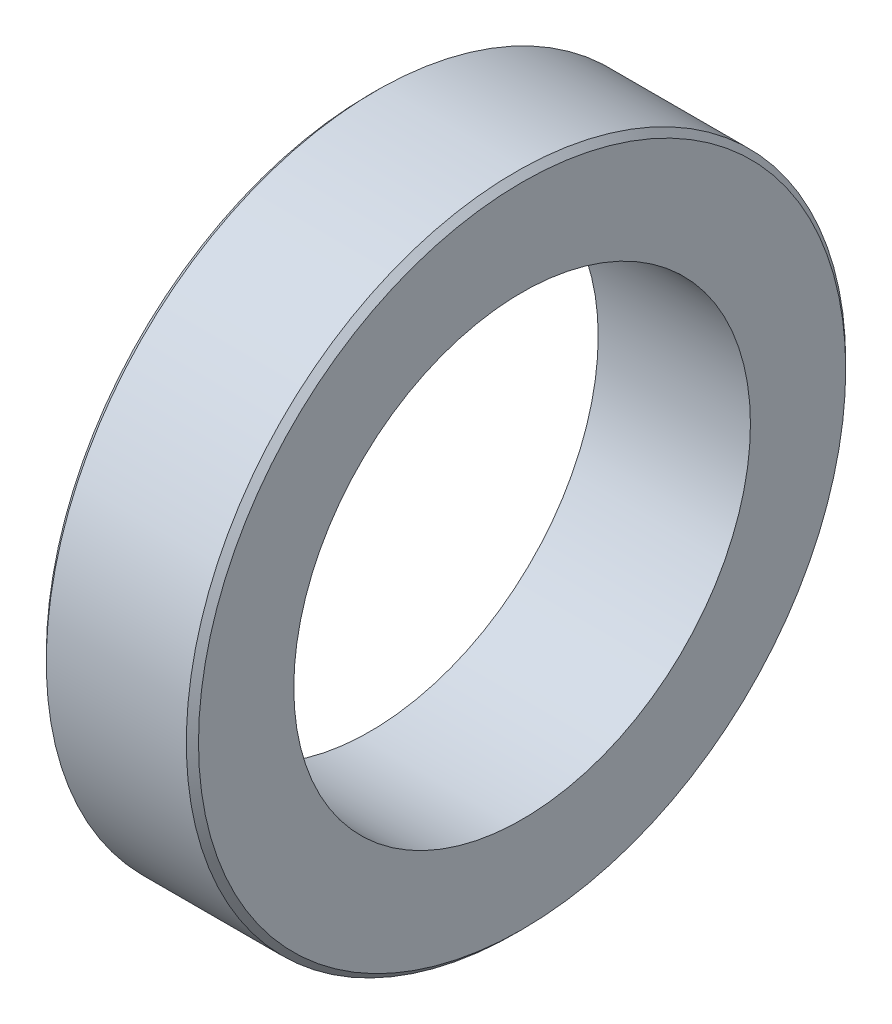
ISO-10303-21;
HEADER;
FILE_DESCRIPTION(('STEP AP214'),'2;1');
FILE_NAME('part.step','',(''),(''),'','','');
FILE_SCHEMA(('AUTOMOTIVE_DESIGN { 1 0 10303 214 1 1 1 1 }'));
ENDSEC;
DATA;
#1=APPLICATION_CONTEXT('core data for automotive mechanical design processes');
#2=APPLICATION_PROTOCOL_DEFINITION('international standard','automotive_design',2000,#1);
#3=PRODUCT_CONTEXT('',#1,'mechanical');
#4=PRODUCT('Part','Part','',(#3));
#5=PRODUCT_RELATED_PRODUCT_CATEGORY('part','',(#4));
#6=PRODUCT_DEFINITION_FORMATION('','',#4);
#7=PRODUCT_DEFINITION_CONTEXT('part definition',#1,'design');
#8=PRODUCT_DEFINITION('design','',#6,#7);
#9=PRODUCT_DEFINITION_SHAPE('','',#8);
#10=(LENGTH_UNIT() NAMED_UNIT(*) SI_UNIT(.MILLI.,.METRE.));
#11=(NAMED_UNIT(*) PLANE_ANGLE_UNIT() SI_UNIT($,.RADIAN.));
#12=(NAMED_UNIT(*) SI_UNIT($,.STERADIAN.) SOLID_ANGLE_UNIT());
#13=UNCERTAINTY_MEASURE_WITH_UNIT(LENGTH_MEASURE(1.E-05),#10,'distance_accuracy_value','');
#14=(GEOMETRIC_REPRESENTATION_CONTEXT(3) GLOBAL_UNCERTAINTY_ASSIGNED_CONTEXT((#13)) GLOBAL_UNIT_ASSIGNED_CONTEXT((#10,
#11,#12)) REPRESENTATION_CONTEXT('',''));
#15=CARTESIAN_POINT('',(0.,0.,0.));
#16=DIRECTION('',(0.,0.,1.));
#17=DIRECTION('',(1.,0.,0.));
#18=AXIS2_PLACEMENT_3D('',#15,#16,#17);
#19=CARTESIAN_POINT('',(38.1,0.,0.));
#20=DIRECTION('',(-1.,0.,0.));
#21=DIRECTION('',(0.,0.,1.));
#22=AXIS2_PLACEMENT_3D('',#19,#20,#21);
#23=CYLINDRICAL_SURFACE('',#22,82.5246);
#24=CARTESIAN_POINT('',(36.576,0.,0.));
#25=DIRECTION('',(1.,0.,0.));
#26=DIRECTION('',(0.,0.,-1.));
#27=AXIS2_PLACEMENT_3D('',#24,#25,#26);
#28=CIRCLE('',#27,82.5246);
#29=CARTESIAN_POINT('',(36.576,0.,-82.5246));
#30=VERTEX_POINT('',#29);
#31=EDGE_CURVE('E47',#30,#30,#28,.F.);
#32=ORIENTED_EDGE('',*,*,#31,.T.);
#33=EDGE_LOOP('',(#32));
#34=FACE_BOUND('',#33,.T.);
#35=CARTESIAN_POINT('',(1.52399999999996,0.,0.));
#36=DIRECTION('',(1.,0.,0.));
#37=DIRECTION('',(0.,0.,-1.));
#38=AXIS2_PLACEMENT_3D('',#35,#36,#37);
#39=CIRCLE('',#38,82.5246);
#40=CARTESIAN_POINT('',(1.52399999999996,0.,-82.5246));
#41=VERTEX_POINT('',#40);
#42=EDGE_CURVE('E51',#41,#41,#39,.T.);
#43=ORIENTED_EDGE('',*,*,#42,.T.);
#44=EDGE_LOOP('',(#43));
#45=FACE_BOUND('',#44,.T.);
#46=ADVANCED_FACE('F39',(#34,#45),#23,.T.);
#47=CARTESIAN_POINT('',(38.1,0.,0.));
#48=DIRECTION('',(1.,0.,0.));
#49=DIRECTION('',(0.,0.,-1.));
#50=AXIS2_PLACEMENT_3D('',#47,#48,#49);
#51=PLANE('',#50);
#52=CARTESIAN_POINT('',(38.1,0.,0.));
#53=DIRECTION('',(1.,0.,0.));
#54=DIRECTION('',(0.,0.,-1.));
#55=AXIS2_PLACEMENT_3D('',#52,#53,#54);
#56=CIRCLE('',#55,81.0006);
#57=CARTESIAN_POINT('',(38.1,0.,-81.0006));
#58=VERTEX_POINT('',#57);
#59=EDGE_CURVE('E55',#58,#58,#56,.T.);
#60=ORIENTED_EDGE('',*,*,#59,.T.);
#61=EDGE_LOOP('',(#60));
#62=FACE_BOUND('',#61,.T.);
#63=CARTESIAN_POINT('',(38.1,0.,0.));
#64=DIRECTION('',(1.,0.,0.));
#65=DIRECTION('',(0.,0.,-1.));
#66=AXIS2_PLACEMENT_3D('',#63,#64,#65);
#67=CIRCLE('',#66,57.15);
#68=CARTESIAN_POINT('',(38.1,0.,-57.15));
#69=VERTEX_POINT('',#68);
#70=EDGE_CURVE('E60',#69,#69,#67,.T.);
#71=ORIENTED_EDGE('',*,*,#70,.F.);
#72=EDGE_LOOP('',(#71));
#73=FACE_BOUND('',#72,.T.);
#74=ADVANCED_FACE('F70',(#62,#73),#51,.T.);
#75=CARTESIAN_POINT('',(0.,0.,0.));
#76=DIRECTION('',(1.,0.,0.));
#77=DIRECTION('',(0.,0.,-1.));
#78=AXIS2_PLACEMENT_3D('',#75,#76,#77);
#79=PLANE('',#78);
#80=CARTESIAN_POINT('',(0.,0.,0.));
#81=DIRECTION('',(1.,0.,0.));
#82=DIRECTION('',(0.,0.,-1.));
#83=AXIS2_PLACEMENT_3D('',#80,#81,#82);
#84=CIRCLE('',#83,81.0006);
#85=CARTESIAN_POINT('',(0.,0.,-81.0006));
#86=VERTEX_POINT('',#85);
#87=EDGE_CURVE('E10',#86,#86,#84,.F.);
#88=ORIENTED_EDGE('',*,*,#87,.T.);
#89=EDGE_LOOP('',(#88));
#90=FACE_BOUND('',#89,.T.);
#91=CARTESIAN_POINT('',(0.,0.,0.));
#92=DIRECTION('',(1.,0.,0.));
#93=DIRECTION('',(0.,0.,-1.));
#94=AXIS2_PLACEMENT_3D('',#91,#92,#93);
#95=CIRCLE('',#94,57.15);
#96=CARTESIAN_POINT('',(0.,0.,-57.15));
#97=VERTEX_POINT('',#96);
#98=EDGE_CURVE('E61',#97,#97,#95,.T.);
#99=ORIENTED_EDGE('',*,*,#98,.T.);
#100=EDGE_LOOP('',(#99));
#101=FACE_BOUND('',#100,.T.);
#102=ADVANCED_FACE('F72',(#90,#101),#79,.F.);
#103=CARTESIAN_POINT('',(38.1,0.,0.));
#104=DIRECTION('',(-1.,0.,0.));
#105=DIRECTION('',(0.,0.,1.));
#106=AXIS2_PLACEMENT_3D('',#103,#104,#105);
#107=CYLINDRICAL_SURFACE('',#106,57.15);
#108=ORIENTED_EDGE('',*,*,#70,.T.);
#109=EDGE_LOOP('',(#108));
#110=FACE_BOUND('',#109,.T.);
#111=ORIENTED_EDGE('',*,*,#98,.F.);
#112=EDGE_LOOP('',(#111));
#113=FACE_BOUND('',#112,.T.);
#114=ADVANCED_FACE('F67',(#110,#113),#107,.F.);
#115=CARTESIAN_POINT('',(38.1,0.,0.));
#116=DIRECTION('',(-1.,0.,0.));
#117=DIRECTION('',(0.,0.,1.));
#118=AXIS2_PLACEMENT_3D('',#115,#116,#117);
#119=CONICAL_SURFACE('',#118,81.0006,0.785398163397448);
#120=ORIENTED_EDGE('',*,*,#31,.F.);
#121=EDGE_LOOP('',(#120));
#122=FACE_BOUND('',#121,.T.);
#123=ORIENTED_EDGE('',*,*,#59,.F.);
#124=EDGE_LOOP('',(#123));
#125=FACE_BOUND('',#124,.T.);
#126=ADVANCED_FACE('F83',(#122,#125),#119,.T.);
#127=CARTESIAN_POINT('',(1.52399999999996,0.,0.));
#128=DIRECTION('',(1.,0.,0.));
#129=DIRECTION('',(0.,0.,-1.));
#130=AXIS2_PLACEMENT_3D('',#127,#128,#129);
#131=CONICAL_SURFACE('',#130,82.5246,0.785398163397457);
#132=ORIENTED_EDGE('',*,*,#87,.F.);
#133=EDGE_LOOP('',(#132));
#134=FACE_BOUND('',#133,.T.);
#135=ORIENTED_EDGE('',*,*,#42,.F.);
#136=EDGE_LOOP('',(#135));
#137=FACE_BOUND('',#136,.T.);
#138=ADVANCED_FACE('F42',(#134,#137),#131,.T.);
#139=CLOSED_SHELL('',(#46,#74,#102,#114,#126,#138));
#140=MANIFOLD_SOLID_BREP('B2',#139);
#141=ADVANCED_BREP_SHAPE_REPRESENTATION('',(#18,#140),#14);
#142=SHAPE_DEFINITION_REPRESENTATION(#9,#141);
ENDSEC;
END-ISO-10303-21;
